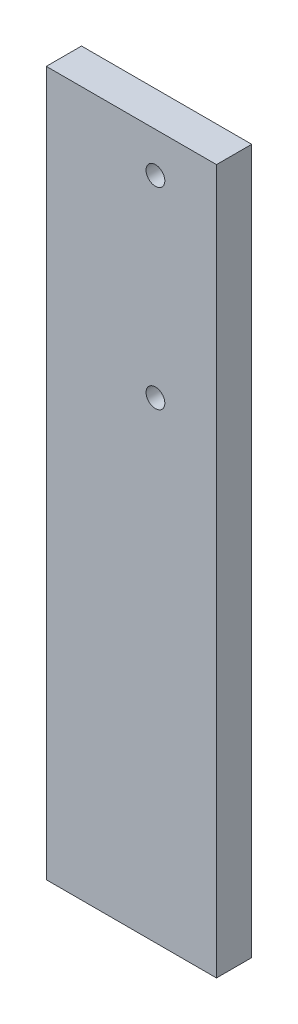
ISO-10303-21;
HEADER;
FILE_DESCRIPTION(('STEP AP214'),'2;1');
FILE_NAME('part.step','',(''),(''),'','','');
FILE_SCHEMA(('AUTOMOTIVE_DESIGN { 1 0 10303 214 1 1 1 1 }'));
ENDSEC;
DATA;
#1=APPLICATION_CONTEXT('core data for automotive mechanical design processes');
#2=APPLICATION_PROTOCOL_DEFINITION('international standard','automotive_design',2000,#1);
#3=PRODUCT_CONTEXT('',#1,'mechanical');
#4=PRODUCT('Part','Part','',(#3));
#5=PRODUCT_RELATED_PRODUCT_CATEGORY('part','',(#4));
#6=PRODUCT_DEFINITION_FORMATION('','',#4);
#7=PRODUCT_DEFINITION_CONTEXT('part definition',#1,'design');
#8=PRODUCT_DEFINITION('design','',#6,#7);
#9=PRODUCT_DEFINITION_SHAPE('','',#8);
#10=(LENGTH_UNIT() NAMED_UNIT(*) SI_UNIT(.MILLI.,.METRE.));
#11=(NAMED_UNIT(*) PLANE_ANGLE_UNIT() SI_UNIT($,.RADIAN.));
#12=(NAMED_UNIT(*) SI_UNIT($,.STERADIAN.) SOLID_ANGLE_UNIT());
#13=UNCERTAINTY_MEASURE_WITH_UNIT(LENGTH_MEASURE(1.E-05),#10,'distance_accuracy_value','');
#14=(GEOMETRIC_REPRESENTATION_CONTEXT(3) GLOBAL_UNCERTAINTY_ASSIGNED_CONTEXT((#13)) GLOBAL_UNIT_ASSIGNED_CONTEXT((#10,
#11,#12)) REPRESENTATION_CONTEXT('',''));
#15=CARTESIAN_POINT('',(0.,0.,0.));
#16=DIRECTION('',(0.,0.,1.));
#17=DIRECTION('',(1.,0.,0.));
#18=AXIS2_PLACEMENT_3D('',#15,#16,#17);
#19=CARTESIAN_POINT('',(0.,0.,15.));
#20=DIRECTION('',(0.,0.,-1.));
#21=DIRECTION('',(-1.,0.,0.));
#22=AXIS2_PLACEMENT_3D('',#19,#20,#21);
#23=PLANE('',#22);
#24=CARTESIAN_POINT('',(46.48,283.,15.));
#25=DIRECTION('',(0.,0.,1.));
#26=DIRECTION('',(1.,0.,0.));
#27=AXIS2_PLACEMENT_3D('',#24,#25,#26);
#28=CIRCLE('',#27,4.00000000000001);
#29=CARTESIAN_POINT('',(50.48,283.,15.));
#30=VERTEX_POINT('',#29);
#31=EDGE_CURVE('E100',#30,#30,#28,.T.);
#32=ORIENTED_EDGE('',*,*,#31,.F.);
#33=EDGE_LOOP('',(#32));
#34=FACE_BOUND('',#33,.T.);
#35=DIRECTION('',(0.,-1.,0.));
#36=VECTOR('',#35,1.);
#37=CARTESIAN_POINT('',(0.,0.,15.));
#38=LINE('',#37,#36);
#39=CARTESIAN_POINT('',(0.,300.,15.));
#40=VERTEX_POINT('',#39);
#41=CARTESIAN_POINT('',(0.,0.,15.));
#42=VERTEX_POINT('',#41);
#43=EDGE_CURVE('E85',#40,#42,#38,.T.);
#44=ORIENTED_EDGE('',*,*,#43,.T.);
#45=DIRECTION('',(1.,0.,0.));
#46=VECTOR('',#45,1.);
#47=CARTESIAN_POINT('',(0.,0.,15.));
#48=LINE('',#47,#46);
#49=CARTESIAN_POINT('',(72.48,0.,15.));
#50=VERTEX_POINT('',#49);
#51=EDGE_CURVE('E80',#42,#50,#48,.T.);
#52=ORIENTED_EDGE('',*,*,#51,.T.);
#53=DIRECTION('',(0.,1.,0.));
#54=VECTOR('',#53,1.);
#55=CARTESIAN_POINT('',(72.48,0.,15.));
#56=LINE('',#55,#54);
#57=CARTESIAN_POINT('',(72.48,300.,15.));
#58=VERTEX_POINT('',#57);
#59=EDGE_CURVE('E83',#50,#58,#56,.T.);
#60=ORIENTED_EDGE('',*,*,#59,.T.);
#61=DIRECTION('',(-1.,0.,0.));
#62=VECTOR('',#61,1.);
#63=CARTESIAN_POINT('',(0.,300.,15.));
#64=LINE('',#63,#62);
#65=EDGE_CURVE('E50',#58,#40,#64,.T.);
#66=ORIENTED_EDGE('',*,*,#65,.T.);
#67=EDGE_LOOP('',(#44,#52,#60,#66));
#68=FACE_BOUND('',#67,.T.);
#69=CARTESIAN_POINT('',(46.48,201.,15.));
#70=DIRECTION('',(0.,0.,1.));
#71=DIRECTION('',(1.,0.,0.));
#72=AXIS2_PLACEMENT_3D('',#69,#70,#71);
#73=CIRCLE('',#72,4.00000000000001);
#74=CARTESIAN_POINT('',(50.48,201.,15.));
#75=VERTEX_POINT('',#74);
#76=EDGE_CURVE('E115',#75,#75,#73,.T.);
#77=ORIENTED_EDGE('',*,*,#76,.F.);
#78=EDGE_LOOP('',(#77));
#79=FACE_BOUND('',#78,.T.);
#80=ADVANCED_FACE('F33',(#34,#68,#79),#23,.F.);
#81=CARTESIAN_POINT('',(0.,0.,0.));
#82=DIRECTION('',(0.,0.,-1.));
#83=DIRECTION('',(-1.,0.,0.));
#84=AXIS2_PLACEMENT_3D('',#81,#82,#83);
#85=PLANE('',#84);
#86=CARTESIAN_POINT('',(46.48,283.,0.));
#87=DIRECTION('',(0.,0.,1.));
#88=DIRECTION('',(1.,0.,0.));
#89=AXIS2_PLACEMENT_3D('',#86,#87,#88);
#90=CIRCLE('',#89,4.00000000000001);
#91=CARTESIAN_POINT('',(50.48,283.,0.));
#92=VERTEX_POINT('',#91);
#93=EDGE_CURVE('E112',#92,#92,#90,.T.);
#94=ORIENTED_EDGE('',*,*,#93,.T.);
#95=EDGE_LOOP('',(#94));
#96=FACE_BOUND('',#95,.T.);
#97=DIRECTION('',(0.,-1.,0.));
#98=VECTOR('',#97,1.);
#99=CARTESIAN_POINT('',(0.,0.,0.));
#100=LINE('',#99,#98);
#101=CARTESIAN_POINT('',(0.,300.,0.));
#102=VERTEX_POINT('',#101);
#103=CARTESIAN_POINT('',(0.,0.,0.));
#104=VERTEX_POINT('',#103);
#105=EDGE_CURVE('E97',#102,#104,#100,.T.);
#106=ORIENTED_EDGE('',*,*,#105,.F.);
#107=DIRECTION('',(-1.,0.,0.));
#108=VECTOR('',#107,1.);
#109=CARTESIAN_POINT('',(0.,300.,0.));
#110=LINE('',#109,#108);
#111=CARTESIAN_POINT('',(72.48,300.,0.));
#112=VERTEX_POINT('',#111);
#113=EDGE_CURVE('E73',#112,#102,#110,.T.);
#114=ORIENTED_EDGE('',*,*,#113,.F.);
#115=DIRECTION('',(0.,1.,0.));
#116=VECTOR('',#115,1.);
#117=CARTESIAN_POINT('',(72.48,0.,0.));
#118=LINE('',#117,#116);
#119=CARTESIAN_POINT('',(72.48,0.,0.));
#120=VERTEX_POINT('',#119);
#121=EDGE_CURVE('E67',#120,#112,#118,.T.);
#122=ORIENTED_EDGE('',*,*,#121,.F.);
#123=DIRECTION('',(1.,0.,0.));
#124=VECTOR('',#123,1.);
#125=CARTESIAN_POINT('',(0.,0.,0.));
#126=LINE('',#125,#124);
#127=EDGE_CURVE('E89',#104,#120,#126,.T.);
#128=ORIENTED_EDGE('',*,*,#127,.F.);
#129=EDGE_LOOP('',(#106,#114,#122,#128));
#130=FACE_BOUND('',#129,.T.);
#131=CARTESIAN_POINT('',(46.48,201.,0.));
#132=DIRECTION('',(0.,0.,1.));
#133=DIRECTION('',(1.,0.,0.));
#134=AXIS2_PLACEMENT_3D('',#131,#132,#133);
#135=CIRCLE('',#134,4.00000000000001);
#136=CARTESIAN_POINT('',(50.48,201.,0.));
#137=VERTEX_POINT('',#136);
#138=EDGE_CURVE('E118',#137,#137,#135,.T.);
#139=ORIENTED_EDGE('',*,*,#138,.T.);
#140=EDGE_LOOP('',(#139));
#141=FACE_BOUND('',#140,.T.);
#142=ADVANCED_FACE('F108',(#96,#130,#141),#85,.T.);
#143=CARTESIAN_POINT('',(0.,0.,15.));
#144=DIRECTION('',(1.,0.,0.));
#145=DIRECTION('',(0.,0.,-1.));
#146=AXIS2_PLACEMENT_3D('',#143,#144,#145);
#147=PLANE('',#146);
#148=ORIENTED_EDGE('',*,*,#105,.T.);
#149=DIRECTION('',(0.,0.,-1.));
#150=VECTOR('',#149,1.);
#151=CARTESIAN_POINT('',(0.,0.,15.));
#152=LINE('',#151,#150);
#153=EDGE_CURVE('E11',#42,#104,#152,.T.);
#154=ORIENTED_EDGE('',*,*,#153,.F.);
#155=ORIENTED_EDGE('',*,*,#43,.F.);
#156=DIRECTION('',(0.,0.,-1.));
#157=VECTOR('',#156,1.);
#158=CARTESIAN_POINT('',(0.,300.,15.));
#159=LINE('',#158,#157);
#160=EDGE_CURVE('E93',#40,#102,#159,.T.);
#161=ORIENTED_EDGE('',*,*,#160,.T.);
#162=EDGE_LOOP('',(#148,#154,#155,#161));
#163=FACE_BOUND('',#162,.T.);
#164=ADVANCED_FACE('F35',(#163),#147,.F.);
#165=CARTESIAN_POINT('',(0.,0.,15.));
#166=DIRECTION('',(0.,1.,0.));
#167=DIRECTION('',(0.,0.,1.));
#168=AXIS2_PLACEMENT_3D('',#165,#166,#167);
#169=PLANE('',#168);
#170=ORIENTED_EDGE('',*,*,#127,.T.);
#171=DIRECTION('',(0.,0.,-1.));
#172=VECTOR('',#171,1.);
#173=CARTESIAN_POINT('',(72.48,0.,15.));
#174=LINE('',#173,#172);
#175=EDGE_CURVE('E42',#50,#120,#174,.T.);
#176=ORIENTED_EDGE('',*,*,#175,.F.);
#177=ORIENTED_EDGE('',*,*,#51,.F.);
#178=ORIENTED_EDGE('',*,*,#153,.T.);
#179=EDGE_LOOP('',(#170,#176,#177,#178));
#180=FACE_BOUND('',#179,.T.);
#181=ADVANCED_FACE('F88',(#180),#169,.F.);
#182=CARTESIAN_POINT('',(72.48,0.,15.));
#183=DIRECTION('',(-1.,0.,0.));
#184=DIRECTION('',(0.,0.,1.));
#185=AXIS2_PLACEMENT_3D('',#182,#183,#184);
#186=PLANE('',#185);
#187=ORIENTED_EDGE('',*,*,#121,.T.);
#188=DIRECTION('',(0.,0.,-1.));
#189=VECTOR('',#188,1.);
#190=CARTESIAN_POINT('',(72.48,300.,15.));
#191=LINE('',#190,#189);
#192=EDGE_CURVE('E90',#58,#112,#191,.T.);
#193=ORIENTED_EDGE('',*,*,#192,.F.);
#194=ORIENTED_EDGE('',*,*,#59,.F.);
#195=ORIENTED_EDGE('',*,*,#175,.T.);
#196=EDGE_LOOP('',(#187,#193,#194,#195));
#197=FACE_BOUND('',#196,.T.);
#198=ADVANCED_FACE('F91',(#197),#186,.F.);
#199=CARTESIAN_POINT('',(0.,300.,15.));
#200=DIRECTION('',(0.,-1.,0.));
#201=DIRECTION('',(0.,0.,-1.));
#202=AXIS2_PLACEMENT_3D('',#199,#200,#201);
#203=PLANE('',#202);
#204=ORIENTED_EDGE('',*,*,#113,.T.);
#205=ORIENTED_EDGE('',*,*,#160,.F.);
#206=ORIENTED_EDGE('',*,*,#65,.F.);
#207=ORIENTED_EDGE('',*,*,#192,.T.);
#208=EDGE_LOOP('',(#204,#205,#206,#207));
#209=FACE_BOUND('',#208,.T.);
#210=ADVANCED_FACE('F105',(#209),#203,.F.);
#211=CARTESIAN_POINT('',(46.48,283.,15.));
#212=DIRECTION('',(0.,0.,-1.));
#213=DIRECTION('',(-1.,0.,0.));
#214=AXIS2_PLACEMENT_3D('',#211,#212,#213);
#215=CYLINDRICAL_SURFACE('',#214,4.00000000000001);
#216=ORIENTED_EDGE('',*,*,#31,.T.);
#217=EDGE_LOOP('',(#216));
#218=FACE_BOUND('',#217,.T.);
#219=ORIENTED_EDGE('',*,*,#93,.F.);
#220=EDGE_LOOP('',(#219));
#221=FACE_BOUND('',#220,.T.);
#222=ADVANCED_FACE('F136',(#218,#221),#215,.F.);
#223=CARTESIAN_POINT('',(46.48,201.,15.));
#224=DIRECTION('',(0.,0.,-1.));
#225=DIRECTION('',(-1.,0.,0.));
#226=AXIS2_PLACEMENT_3D('',#223,#224,#225);
#227=CYLINDRICAL_SURFACE('',#226,4.00000000000001);
#228=ORIENTED_EDGE('',*,*,#76,.T.);
#229=EDGE_LOOP('',(#228));
#230=FACE_BOUND('',#229,.T.);
#231=ORIENTED_EDGE('',*,*,#138,.F.);
#232=EDGE_LOOP('',(#231));
#233=FACE_BOUND('',#232,.T.);
#234=ADVANCED_FACE('F124',(#230,#233),#227,.F.);
#235=CLOSED_SHELL('',(#80,#142,#164,#181,#198,#210,#222,#234));
#236=MANIFOLD_SOLID_BREP('B2',#235);
#237=ADVANCED_BREP_SHAPE_REPRESENTATION('',(#18,#236),#14);
#238=SHAPE_DEFINITION_REPRESENTATION(#9,#237);
ENDSEC;
END-ISO-10303-21;
